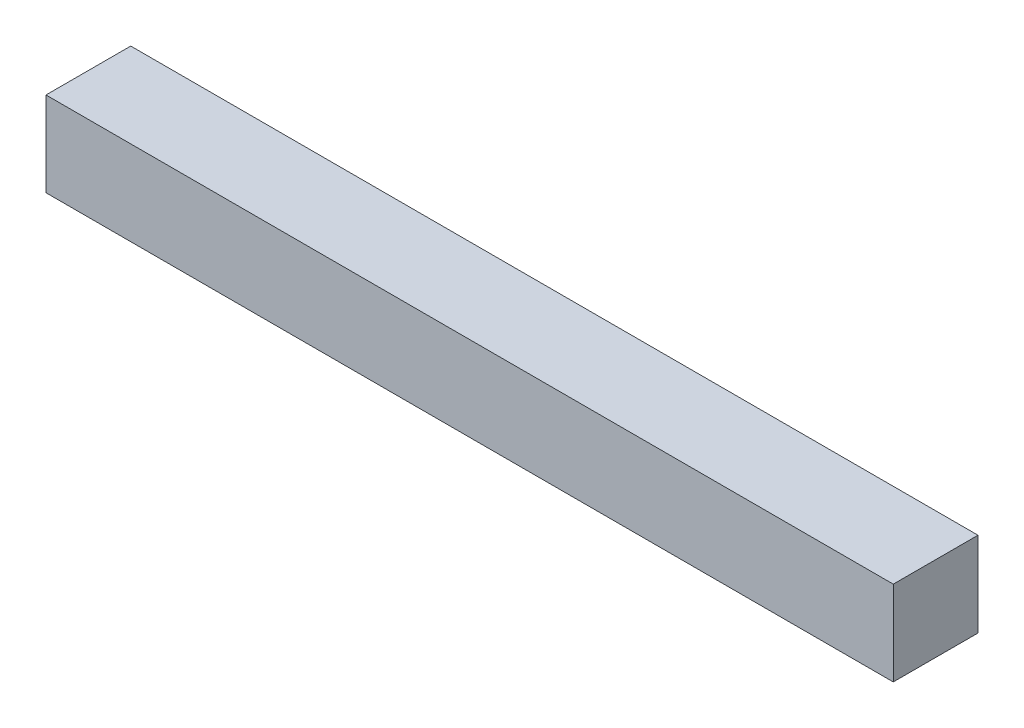
ISO-10303-21;
HEADER;
FILE_DESCRIPTION(('STEP AP214'),'2;1');
FILE_NAME('part.step','',(''),(''),'','','');
FILE_SCHEMA(('AUTOMOTIVE_DESIGN { 1 0 10303 214 1 1 1 1 }'));
ENDSEC;
DATA;
#1=APPLICATION_CONTEXT('core data for automotive mechanical design processes');
#2=APPLICATION_PROTOCOL_DEFINITION('international standard','automotive_design',2000,#1);
#3=PRODUCT_CONTEXT('',#1,'mechanical');
#4=PRODUCT('Part','Part','',(#3));
#5=PRODUCT_RELATED_PRODUCT_CATEGORY('part','',(#4));
#6=PRODUCT_DEFINITION_FORMATION('','',#4);
#7=PRODUCT_DEFINITION_CONTEXT('part definition',#1,'design');
#8=PRODUCT_DEFINITION('design','',#6,#7);
#9=PRODUCT_DEFINITION_SHAPE('','',#8);
#10=(LENGTH_UNIT() NAMED_UNIT(*) SI_UNIT(.MILLI.,.METRE.));
#11=(NAMED_UNIT(*) PLANE_ANGLE_UNIT() SI_UNIT($,.RADIAN.));
#12=(NAMED_UNIT(*) SI_UNIT($,.STERADIAN.) SOLID_ANGLE_UNIT());
#13=UNCERTAINTY_MEASURE_WITH_UNIT(LENGTH_MEASURE(1.E-05),#10,'distance_accuracy_value','');
#14=(GEOMETRIC_REPRESENTATION_CONTEXT(3) GLOBAL_UNCERTAINTY_ASSIGNED_CONTEXT((#13)) GLOBAL_UNIT_ASSIGNED_CONTEXT((#10,
#11,#12)) REPRESENTATION_CONTEXT('',''));
#15=CARTESIAN_POINT('',(0.,0.,0.));
#16=DIRECTION('',(0.,0.,1.));
#17=DIRECTION('',(1.,0.,0.));
#18=AXIS2_PLACEMENT_3D('',#15,#16,#17);
#19=CARTESIAN_POINT('',(200.,1400.,-750.));
#20=DIRECTION('',(-1.,0.,0.));
#21=DIRECTION('',(0.,0.,1.));
#22=AXIS2_PLACEMENT_3D('',#19,#20,#21);
#23=PLANE('',#22);
#24=DIRECTION('',(0.,-1.,0.));
#25=VECTOR('',#24,1.);
#26=CARTESIAN_POINT('',(200.,1400.,-650.));
#27=LINE('',#26,#25);
#28=CARTESIAN_POINT('',(200.,1500.,-650.));
#29=VERTEX_POINT('',#28);
#30=CARTESIAN_POINT('',(200.,1400.,-650.));
#31=VERTEX_POINT('',#30);
#32=EDGE_CURVE('E103',#29,#31,#27,.T.);
#33=ORIENTED_EDGE('',*,*,#32,.F.);
#34=DIRECTION('',(0.,0.,1.));
#35=VECTOR('',#34,1.);
#36=CARTESIAN_POINT('',(200.,1500.,-750.));
#37=LINE('',#36,#35);
#38=CARTESIAN_POINT('',(200.,1500.,-750.));
#39=VERTEX_POINT('',#38);
#40=EDGE_CURVE('E11',#39,#29,#37,.T.);
#41=ORIENTED_EDGE('',*,*,#40,.F.);
#42=DIRECTION('',(0.,-1.,0.));
#43=VECTOR('',#42,1.);
#44=CARTESIAN_POINT('',(200.,1400.,-750.));
#45=LINE('',#44,#43);
#46=CARTESIAN_POINT('',(200.,1400.,-750.));
#47=VERTEX_POINT('',#46);
#48=EDGE_CURVE('E97',#39,#47,#45,.T.);
#49=ORIENTED_EDGE('',*,*,#48,.T.);
#50=DIRECTION('',(0.,0.,1.));
#51=VECTOR('',#50,1.);
#52=CARTESIAN_POINT('',(200.,1400.,-750.));
#53=LINE('',#52,#51);
#54=EDGE_CURVE('E42',#47,#31,#53,.T.);
#55=ORIENTED_EDGE('',*,*,#54,.T.);
#56=EDGE_LOOP('',(#33,#41,#49,#55));
#57=FACE_BOUND('',#56,.T.);
#58=ADVANCED_FACE('F39',(#57),#23,.T.);
#59=CARTESIAN_POINT('',(200.,1500.,-750.));
#60=DIRECTION('',(0.,1.,0.));
#61=DIRECTION('',(0.,0.,1.));
#62=AXIS2_PLACEMENT_3D('',#59,#60,#61);
#63=PLANE('',#62);
#64=DIRECTION('',(-1.,0.,0.));
#65=VECTOR('',#64,1.);
#66=CARTESIAN_POINT('',(200.,1500.,-650.));
#67=LINE('',#66,#65);
#68=CARTESIAN_POINT('',(1200.,1500.,-650.));
#69=VERTEX_POINT('',#68);
#70=EDGE_CURVE('E99',#69,#29,#67,.T.);
#71=ORIENTED_EDGE('',*,*,#70,.F.);
#72=DIRECTION('',(0.,0.,1.));
#73=VECTOR('',#72,1.);
#74=CARTESIAN_POINT('',(1200.,1500.,-750.));
#75=LINE('',#74,#73);
#76=CARTESIAN_POINT('',(1200.,1500.,-750.));
#77=VERTEX_POINT('',#76);
#78=EDGE_CURVE('E48',#77,#69,#75,.T.);
#79=ORIENTED_EDGE('',*,*,#78,.F.);
#80=DIRECTION('',(-1.,0.,0.));
#81=VECTOR('',#80,1.);
#82=CARTESIAN_POINT('',(200.,1500.,-750.));
#83=LINE('',#82,#81);
#84=EDGE_CURVE('E94',#77,#39,#83,.T.);
#85=ORIENTED_EDGE('',*,*,#84,.T.);
#86=ORIENTED_EDGE('',*,*,#40,.T.);
#87=EDGE_LOOP('',(#71,#79,#85,#86));
#88=FACE_BOUND('',#87,.T.);
#89=ADVANCED_FACE('F113',(#88),#63,.T.);
#90=CARTESIAN_POINT('',(1200.,1400.,-750.));
#91=DIRECTION('',(1.,0.,0.));
#92=DIRECTION('',(0.,0.,-1.));
#93=AXIS2_PLACEMENT_3D('',#90,#91,#92);
#94=PLANE('',#93);
#95=DIRECTION('',(0.,1.,0.));
#96=VECTOR('',#95,1.);
#97=CARTESIAN_POINT('',(1200.,1400.,-650.));
#98=LINE('',#97,#96);
#99=CARTESIAN_POINT('',(1200.,1400.,-650.));
#100=VERTEX_POINT('',#99);
#101=EDGE_CURVE('E89',#100,#69,#98,.T.);
#102=ORIENTED_EDGE('',*,*,#101,.F.);
#103=DIRECTION('',(0.,0.,1.));
#104=VECTOR('',#103,1.);
#105=CARTESIAN_POINT('',(1200.,1400.,-750.));
#106=LINE('',#105,#104);
#107=CARTESIAN_POINT('',(1200.,1400.,-750.));
#108=VERTEX_POINT('',#107);
#109=EDGE_CURVE('E84',#108,#100,#106,.T.);
#110=ORIENTED_EDGE('',*,*,#109,.F.);
#111=DIRECTION('',(0.,1.,0.));
#112=VECTOR('',#111,1.);
#113=CARTESIAN_POINT('',(1200.,1400.,-750.));
#114=LINE('',#113,#112);
#115=EDGE_CURVE('E87',#108,#77,#114,.T.);
#116=ORIENTED_EDGE('',*,*,#115,.T.);
#117=ORIENTED_EDGE('',*,*,#78,.T.);
#118=EDGE_LOOP('',(#102,#110,#116,#117));
#119=FACE_BOUND('',#118,.T.);
#120=ADVANCED_FACE('F86',(#119),#94,.T.);
#121=CARTESIAN_POINT('',(200.,1400.,-750.));
#122=DIRECTION('',(0.,-1.,0.));
#123=DIRECTION('',(0.,0.,-1.));
#124=AXIS2_PLACEMENT_3D('',#121,#122,#123);
#125=PLANE('',#124);
#126=DIRECTION('',(1.,0.,0.));
#127=VECTOR('',#126,1.);
#128=CARTESIAN_POINT('',(200.,1400.,-650.));
#129=LINE('',#128,#127);
#130=EDGE_CURVE('E106',#31,#100,#129,.T.);
#131=ORIENTED_EDGE('',*,*,#130,.F.);
#132=ORIENTED_EDGE('',*,*,#54,.F.);
#133=DIRECTION('',(1.,0.,0.));
#134=VECTOR('',#133,1.);
#135=CARTESIAN_POINT('',(200.,1400.,-750.));
#136=LINE('',#135,#134);
#137=EDGE_CURVE('E93',#47,#108,#136,.T.);
#138=ORIENTED_EDGE('',*,*,#137,.T.);
#139=ORIENTED_EDGE('',*,*,#109,.T.);
#140=EDGE_LOOP('',(#131,#132,#138,#139));
#141=FACE_BOUND('',#140,.T.);
#142=ADVANCED_FACE('F96',(#141),#125,.T.);
#143=CARTESIAN_POINT('',(0.,0.,-750.));
#144=DIRECTION('',(0.,0.,-1.));
#145=DIRECTION('',(-1.,0.,0.));
#146=AXIS2_PLACEMENT_3D('',#143,#144,#145);
#147=PLANE('',#146);
#148=ORIENTED_EDGE('',*,*,#48,.F.);
#149=ORIENTED_EDGE('',*,*,#84,.F.);
#150=ORIENTED_EDGE('',*,*,#115,.F.);
#151=ORIENTED_EDGE('',*,*,#137,.F.);
#152=EDGE_LOOP('',(#148,#149,#150,#151));
#153=FACE_BOUND('',#152,.T.);
#154=ADVANCED_FACE('F92',(#153),#147,.T.);
#155=CARTESIAN_POINT('',(0.,0.,-650.));
#156=DIRECTION('',(0.,0.,-1.));
#157=DIRECTION('',(-1.,0.,0.));
#158=AXIS2_PLACEMENT_3D('',#155,#156,#157);
#159=PLANE('',#158);
#160=ORIENTED_EDGE('',*,*,#32,.T.);
#161=ORIENTED_EDGE('',*,*,#130,.T.);
#162=ORIENTED_EDGE('',*,*,#101,.T.);
#163=ORIENTED_EDGE('',*,*,#70,.T.);
#164=EDGE_LOOP('',(#160,#161,#162,#163));
#165=FACE_BOUND('',#164,.T.);
#166=ADVANCED_FACE('F112',(#165),#159,.F.);
#167=CLOSED_SHELL('',(#58,#89,#120,#142,#154,#166));
#168=MANIFOLD_SOLID_BREP('B2',#167);
#169=ADVANCED_BREP_SHAPE_REPRESENTATION('',(#18,#168),#14);
#170=SHAPE_DEFINITION_REPRESENTATION(#9,#169);
ENDSEC;
END-ISO-10303-21;
